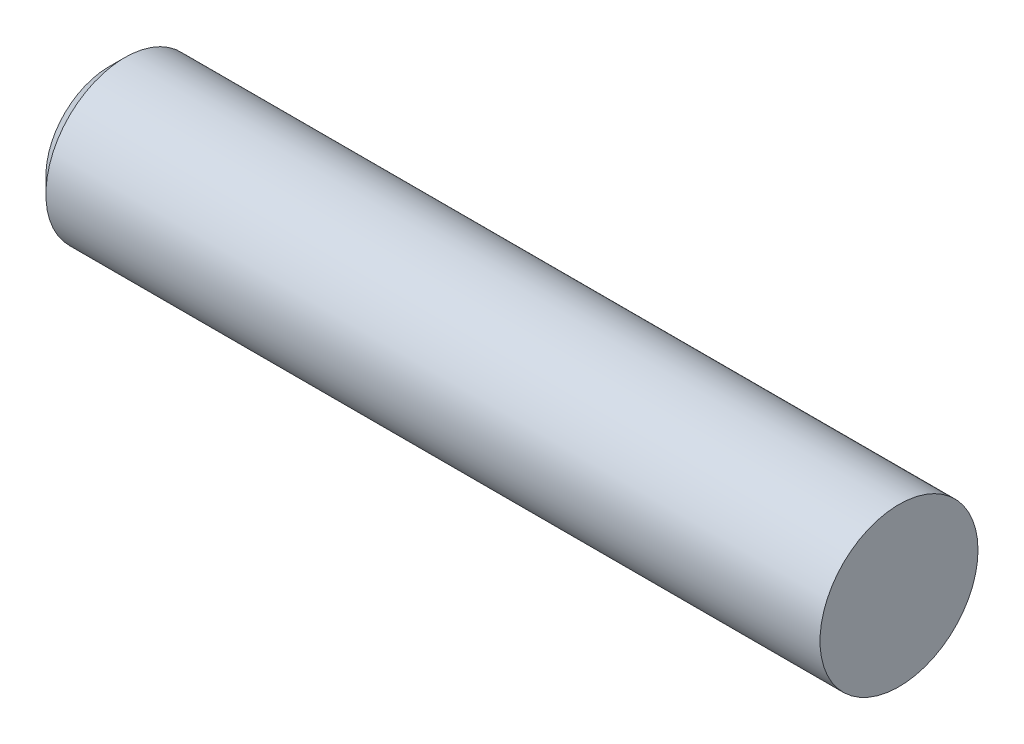
ISO-10303-21;
HEADER;
FILE_DESCRIPTION(('STEP AP214'),'2;1');
FILE_NAME('part.step','',(''),(''),'','','');
FILE_SCHEMA(('AUTOMOTIVE_DESIGN { 1 0 10303 214 1 1 1 1 }'));
ENDSEC;
DATA;
#1=APPLICATION_CONTEXT('core data for automotive mechanical design processes');
#2=APPLICATION_PROTOCOL_DEFINITION('international standard','automotive_design',2000,#1);
#3=PRODUCT_CONTEXT('',#1,'mechanical');
#4=PRODUCT('Part','Part','',(#3));
#5=PRODUCT_RELATED_PRODUCT_CATEGORY('part','',(#4));
#6=PRODUCT_DEFINITION_FORMATION('','',#4);
#7=PRODUCT_DEFINITION_CONTEXT('part definition',#1,'design');
#8=PRODUCT_DEFINITION('design','',#6,#7);
#9=PRODUCT_DEFINITION_SHAPE('','',#8);
#10=(LENGTH_UNIT() NAMED_UNIT(*) SI_UNIT(.MILLI.,.METRE.));
#11=(NAMED_UNIT(*) PLANE_ANGLE_UNIT() SI_UNIT($,.RADIAN.));
#12=(NAMED_UNIT(*) SI_UNIT($,.STERADIAN.) SOLID_ANGLE_UNIT());
#13=UNCERTAINTY_MEASURE_WITH_UNIT(LENGTH_MEASURE(1.E-05),#10,'distance_accuracy_value','');
#14=(GEOMETRIC_REPRESENTATION_CONTEXT(3) GLOBAL_UNCERTAINTY_ASSIGNED_CONTEXT((#13)) GLOBAL_UNIT_ASSIGNED_CONTEXT((#10,
#11,#12)) REPRESENTATION_CONTEXT('',''));
#15=CARTESIAN_POINT('',(0.,0.,0.));
#16=DIRECTION('',(0.,0.,1.));
#17=DIRECTION('',(1.,0.,0.));
#18=AXIS2_PLACEMENT_3D('',#15,#16,#17);
#19=CARTESIAN_POINT('',(-7.9375,0.,0.));
#20=DIRECTION('',(1.,0.,0.));
#21=DIRECTION('',(0.,0.,-1.));
#22=AXIS2_PLACEMENT_3D('',#19,#20,#21);
#23=CYLINDRICAL_SURFACE('',#22,1.5875);
#24=CARTESIAN_POINT('',(7.9375,0.,0.));
#25=DIRECTION('',(1.,0.,0.));
#26=DIRECTION('',(0.,0.,-1.));
#27=AXIS2_PLACEMENT_3D('',#24,#25,#26);
#28=CIRCLE('',#27,1.5875);
#29=CARTESIAN_POINT('',(7.9375,0.,-1.5875));
#30=VERTEX_POINT('',#29);
#31=EDGE_CURVE('E34',#30,#30,#28,.T.);
#32=ORIENTED_EDGE('',*,*,#31,.F.);
#33=EDGE_LOOP('',(#32));
#34=FACE_BOUND('',#33,.T.);
#35=CARTESIAN_POINT('',(-7.62,0.,0.));
#36=DIRECTION('',(1.,0.,0.));
#37=DIRECTION('',(0.,0.,-1.));
#38=AXIS2_PLACEMENT_3D('',#35,#36,#37);
#39=CIRCLE('',#38,1.5875);
#40=CARTESIAN_POINT('',(-7.62,0.,-1.5875));
#41=VERTEX_POINT('',#40);
#42=EDGE_CURVE('E38',#41,#41,#39,.T.);
#43=ORIENTED_EDGE('',*,*,#42,.T.);
#44=EDGE_LOOP('',(#43));
#45=FACE_BOUND('',#44,.T.);
#46=ADVANCED_FACE('F31',(#34,#45),#23,.T.);
#47=CARTESIAN_POINT('',(-7.9375,0.,0.));
#48=DIRECTION('',(1.,0.,0.));
#49=DIRECTION('',(0.,0.,-1.));
#50=AXIS2_PLACEMENT_3D('',#47,#48,#49);
#51=PLANE('',#50);
#52=CARTESIAN_POINT('',(-7.9375,0.,0.));
#53=DIRECTION('',(1.,0.,0.));
#54=DIRECTION('',(0.,0.,-1.));
#55=AXIS2_PLACEMENT_3D('',#52,#53,#54);
#56=CIRCLE('',#55,1.27);
#57=CARTESIAN_POINT('',(-7.9375,0.,-1.27));
#58=VERTEX_POINT('',#57);
#59=EDGE_CURVE('E10',#58,#58,#56,.F.);
#60=ORIENTED_EDGE('',*,*,#59,.T.);
#61=EDGE_LOOP('',(#60));
#62=FACE_BOUND('',#61,.T.);
#63=ADVANCED_FACE('F51',(#62),#51,.F.);
#64=CARTESIAN_POINT('',(7.9375,0.,0.));
#65=DIRECTION('',(1.,0.,0.));
#66=DIRECTION('',(0.,0.,-1.));
#67=AXIS2_PLACEMENT_3D('',#64,#65,#66);
#68=PLANE('',#67);
#69=ORIENTED_EDGE('',*,*,#31,.T.);
#70=EDGE_LOOP('',(#69));
#71=FACE_BOUND('',#70,.T.);
#72=ADVANCED_FACE('F48',(#71),#68,.T.);
#73=CARTESIAN_POINT('',(-7.62,0.,0.));
#74=DIRECTION('',(1.,0.,0.));
#75=DIRECTION('',(0.,0.,-1.));
#76=AXIS2_PLACEMENT_3D('',#73,#74,#75);
#77=CONICAL_SURFACE('',#76,1.5875,0.785398163397451);
#78=ORIENTED_EDGE('',*,*,#59,.F.);
#79=EDGE_LOOP('',(#78));
#80=FACE_BOUND('',#79,.T.);
#81=ORIENTED_EDGE('',*,*,#42,.F.);
#82=EDGE_LOOP('',(#81));
#83=FACE_BOUND('',#82,.T.);
#84=ADVANCED_FACE('F59',(#80,#83),#77,.T.);
#85=CLOSED_SHELL('',(#46,#63,#72,#84));
#86=MANIFOLD_SOLID_BREP('B2',#85);
#87=ADVANCED_BREP_SHAPE_REPRESENTATION('',(#18,#86),#14);
#88=SHAPE_DEFINITION_REPRESENTATION(#9,#87);
ENDSEC;
END-ISO-10303-21;
